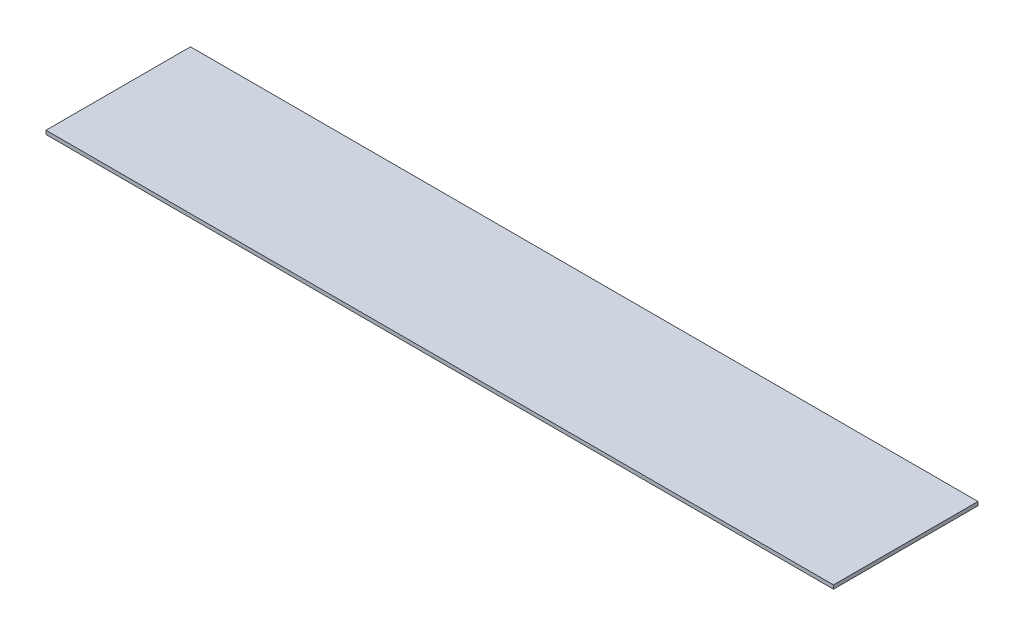
ISO-10303-21;
HEADER;
FILE_DESCRIPTION(('STEP AP214'),'2;1');
FILE_NAME('part.step','',(''),(''),'','','');
FILE_SCHEMA(('AUTOMOTIVE_DESIGN { 1 0 10303 214 1 1 1 1 }'));
ENDSEC;
DATA;
#1=APPLICATION_CONTEXT('core data for automotive mechanical design processes');
#2=APPLICATION_PROTOCOL_DEFINITION('international standard','automotive_design',2000,#1);
#3=PRODUCT_CONTEXT('',#1,'mechanical');
#4=PRODUCT('Part','Part','',(#3));
#5=PRODUCT_RELATED_PRODUCT_CATEGORY('part','',(#4));
#6=PRODUCT_DEFINITION_FORMATION('','',#4);
#7=PRODUCT_DEFINITION_CONTEXT('part definition',#1,'design');
#8=PRODUCT_DEFINITION('design','',#6,#7);
#9=PRODUCT_DEFINITION_SHAPE('','',#8);
#10=(LENGTH_UNIT() NAMED_UNIT(*) SI_UNIT(.MILLI.,.METRE.));
#11=(NAMED_UNIT(*) PLANE_ANGLE_UNIT() SI_UNIT($,.RADIAN.));
#12=(NAMED_UNIT(*) SI_UNIT($,.STERADIAN.) SOLID_ANGLE_UNIT());
#13=UNCERTAINTY_MEASURE_WITH_UNIT(LENGTH_MEASURE(1.E-05),#10,'distance_accuracy_value','');
#14=(GEOMETRIC_REPRESENTATION_CONTEXT(3) GLOBAL_UNCERTAINTY_ASSIGNED_CONTEXT((#13)) GLOBAL_UNIT_ASSIGNED_CONTEXT((#10,
#11,#12)) REPRESENTATION_CONTEXT('',''));
#15=CARTESIAN_POINT('',(0.,0.,0.));
#16=DIRECTION('',(0.,0.,1.));
#17=DIRECTION('',(1.,0.,0.));
#18=AXIS2_PLACEMENT_3D('',#15,#16,#17);
#19=CARTESIAN_POINT('',(-59.1289481870499,4.7625,-156.391847579448));
#20=DIRECTION('',(1.,0.,0.));
#21=DIRECTION('',(0.,0.,-1.));
#22=AXIS2_PLACEMENT_3D('',#19,#20,#21);
#23=PLANE('',#22);
#24=DIRECTION('',(0.,0.,1.));
#25=VECTOR('',#24,1.);
#26=CARTESIAN_POINT('',(-59.1289481870499,0.,-156.391847579448));
#27=LINE('',#26,#25);
#28=CARTESIAN_POINT('',(-59.1289481870499,0.,-156.391847579448));
#29=VERTEX_POINT('',#28);
#30=CARTESIAN_POINT('',(-59.1289481870498,0.,28.4005184205515));
#31=VERTEX_POINT('',#30);
#32=EDGE_CURVE('E98',#29,#31,#27,.T.);
#33=ORIENTED_EDGE('',*,*,#32,.T.);
#34=DIRECTION('',(0.,-1.,0.));
#35=VECTOR('',#34,1.);
#36=CARTESIAN_POINT('',(-59.1289481870498,4.7625,28.4005184205515));
#37=LINE('',#36,#35);
#38=CARTESIAN_POINT('',(-59.1289481870498,4.7625,28.4005184205515));
#39=VERTEX_POINT('',#38);
#40=EDGE_CURVE('E11',#39,#31,#37,.T.);
#41=ORIENTED_EDGE('',*,*,#40,.F.);
#42=DIRECTION('',(0.,0.,1.));
#43=VECTOR('',#42,1.);
#44=CARTESIAN_POINT('',(-59.1289481870499,4.7625,-156.391847579448));
#45=LINE('',#44,#43);
#46=CARTESIAN_POINT('',(-59.1289481870499,4.7625,-156.391847579448));
#47=VERTEX_POINT('',#46);
#48=EDGE_CURVE('E86',#47,#39,#45,.T.);
#49=ORIENTED_EDGE('',*,*,#48,.F.);
#50=DIRECTION('',(0.,-1.,0.));
#51=VECTOR('',#50,1.);
#52=CARTESIAN_POINT('',(-59.1289481870499,4.7625,-156.391847579448));
#53=LINE('',#52,#51);
#54=EDGE_CURVE('E94',#47,#29,#53,.T.);
#55=ORIENTED_EDGE('',*,*,#54,.T.);
#56=EDGE_LOOP('',(#33,#41,#49,#55));
#57=FACE_BOUND('',#56,.T.);
#58=ADVANCED_FACE('F35',(#57),#23,.F.);
#59=CARTESIAN_POINT('',(-59.1289481870498,4.7625,28.4005184205515));
#60=DIRECTION('',(0.,0.,-1.));
#61=DIRECTION('',(-1.,0.,0.));
#62=AXIS2_PLACEMENT_3D('',#59,#60,#61);
#63=PLANE('',#62);
#64=DIRECTION('',(1.,0.,0.));
#65=VECTOR('',#64,1.);
#66=CARTESIAN_POINT('',(-59.1289481870498,0.,28.4005184205515));
#67=LINE('',#66,#65);
#68=CARTESIAN_POINT('',(947.99298981295,0.,28.4005184205515));
#69=VERTEX_POINT('',#68);
#70=EDGE_CURVE('E90',#31,#69,#67,.T.);
#71=ORIENTED_EDGE('',*,*,#70,.T.);
#72=DIRECTION('',(0.,-1.,0.));
#73=VECTOR('',#72,1.);
#74=CARTESIAN_POINT('',(947.99298981295,4.7625,28.4005184205515));
#75=LINE('',#74,#73);
#76=CARTESIAN_POINT('',(947.99298981295,4.7625,28.4005184205515));
#77=VERTEX_POINT('',#76);
#78=EDGE_CURVE('E43',#77,#69,#75,.T.);
#79=ORIENTED_EDGE('',*,*,#78,.F.);
#80=DIRECTION('',(1.,0.,0.));
#81=VECTOR('',#80,1.);
#82=CARTESIAN_POINT('',(-59.1289481870498,4.7625,28.4005184205515));
#83=LINE('',#82,#81);
#84=EDGE_CURVE('E81',#39,#77,#83,.T.);
#85=ORIENTED_EDGE('',*,*,#84,.F.);
#86=ORIENTED_EDGE('',*,*,#40,.T.);
#87=EDGE_LOOP('',(#71,#79,#85,#86));
#88=FACE_BOUND('',#87,.T.);
#89=ADVANCED_FACE('F89',(#88),#63,.F.);
#90=CARTESIAN_POINT('',(947.99298981295,4.7625,-156.391847579448));
#91=DIRECTION('',(-1.,0.,0.));
#92=DIRECTION('',(0.,0.,1.));
#93=AXIS2_PLACEMENT_3D('',#90,#91,#92);
#94=PLANE('',#93);
#95=DIRECTION('',(0.,0.,-1.));
#96=VECTOR('',#95,1.);
#97=CARTESIAN_POINT('',(947.99298981295,0.,-156.391847579448));
#98=LINE('',#97,#96);
#99=CARTESIAN_POINT('',(947.99298981295,0.,-156.391847579448));
#100=VERTEX_POINT('',#99);
#101=EDGE_CURVE('E68',#69,#100,#98,.T.);
#102=ORIENTED_EDGE('',*,*,#101,.T.);
#103=DIRECTION('',(0.,-1.,0.));
#104=VECTOR('',#103,1.);
#105=CARTESIAN_POINT('',(947.99298981295,4.7625,-156.391847579448));
#106=LINE('',#105,#104);
#107=CARTESIAN_POINT('',(947.99298981295,4.7625,-156.391847579448));
#108=VERTEX_POINT('',#107);
#109=EDGE_CURVE('E91',#108,#100,#106,.T.);
#110=ORIENTED_EDGE('',*,*,#109,.F.);
#111=DIRECTION('',(0.,0.,-1.));
#112=VECTOR('',#111,1.);
#113=CARTESIAN_POINT('',(947.99298981295,4.7625,-156.391847579448));
#114=LINE('',#113,#112);
#115=EDGE_CURVE('E84',#77,#108,#114,.T.);
#116=ORIENTED_EDGE('',*,*,#115,.F.);
#117=ORIENTED_EDGE('',*,*,#78,.T.);
#118=EDGE_LOOP('',(#102,#110,#116,#117));
#119=FACE_BOUND('',#118,.T.);
#120=ADVANCED_FACE('F92',(#119),#94,.F.);
#121=CARTESIAN_POINT('',(-59.1289481870499,4.7625,-156.391847579448));
#122=DIRECTION('',(0.,0.,1.));
#123=DIRECTION('',(1.,0.,0.));
#124=AXIS2_PLACEMENT_3D('',#121,#122,#123);
#125=PLANE('',#124);
#126=DIRECTION('',(-1.,0.,0.));
#127=VECTOR('',#126,1.);
#128=CARTESIAN_POINT('',(-59.1289481870499,0.,-156.391847579448));
#129=LINE('',#128,#127);
#130=EDGE_CURVE('E74',#100,#29,#129,.T.);
#131=ORIENTED_EDGE('',*,*,#130,.T.);
#132=ORIENTED_EDGE('',*,*,#54,.F.);
#133=DIRECTION('',(-1.,0.,0.));
#134=VECTOR('',#133,1.);
#135=CARTESIAN_POINT('',(-59.1289481870499,4.7625,-156.391847579448));
#136=LINE('',#135,#134);
#137=EDGE_CURVE('E51',#108,#47,#136,.T.);
#138=ORIENTED_EDGE('',*,*,#137,.F.);
#139=ORIENTED_EDGE('',*,*,#109,.T.);
#140=EDGE_LOOP('',(#131,#132,#138,#139));
#141=FACE_BOUND('',#140,.T.);
#142=ADVANCED_FACE('F105',(#141),#125,.F.);
#143=CARTESIAN_POINT('',(0.,4.7625,0.));
#144=DIRECTION('',(0.,1.,0.));
#145=DIRECTION('',(0.,0.,1.));
#146=AXIS2_PLACEMENT_3D('',#143,#144,#145);
#147=PLANE('',#146);
#148=ORIENTED_EDGE('',*,*,#48,.T.);
#149=ORIENTED_EDGE('',*,*,#84,.T.);
#150=ORIENTED_EDGE('',*,*,#115,.T.);
#151=ORIENTED_EDGE('',*,*,#137,.T.);
#152=EDGE_LOOP('',(#148,#149,#150,#151));
#153=FACE_BOUND('',#152,.T.);
#154=ADVANCED_FACE('F82',(#153),#147,.T.);
#155=CARTESIAN_POINT('',(0.,0.,0.));
#156=DIRECTION('',(0.,1.,0.));
#157=DIRECTION('',(0.,0.,1.));
#158=AXIS2_PLACEMENT_3D('',#155,#156,#157);
#159=PLANE('',#158);
#160=ORIENTED_EDGE('',*,*,#32,.F.);
#161=ORIENTED_EDGE('',*,*,#130,.F.);
#162=ORIENTED_EDGE('',*,*,#101,.F.);
#163=ORIENTED_EDGE('',*,*,#70,.F.);
#164=EDGE_LOOP('',(#160,#161,#162,#163));
#165=FACE_BOUND('',#164,.T.);
#166=ADVANCED_FACE('F108',(#165),#159,.F.);
#167=CLOSED_SHELL('',(#58,#89,#120,#142,#154,#166));
#168=MANIFOLD_SOLID_BREP('B2',#167);
#169=ADVANCED_BREP_SHAPE_REPRESENTATION('',(#18,#168),#14);
#170=SHAPE_DEFINITION_REPRESENTATION(#9,#169);
ENDSEC;
END-ISO-10303-21;
